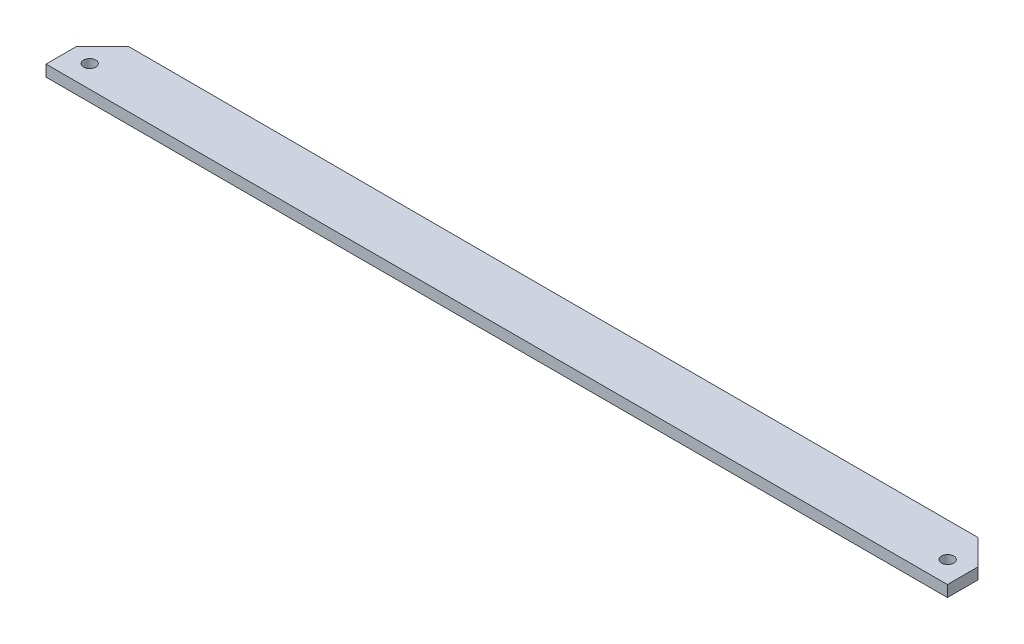
ISO-10303-21;
HEADER;
FILE_DESCRIPTION(('STEP AP214'),'2;1');
FILE_NAME('part.step','',(''),(''),'','','');
FILE_SCHEMA(('AUTOMOTIVE_DESIGN { 1 0 10303 214 1 1 1 1 }'));
ENDSEC;
DATA;
#1=APPLICATION_CONTEXT('core data for automotive mechanical design processes');
#2=APPLICATION_PROTOCOL_DEFINITION('international standard','automotive_design',2000,#1);
#3=PRODUCT_CONTEXT('',#1,'mechanical');
#4=PRODUCT('Part','Part','',(#3));
#5=PRODUCT_RELATED_PRODUCT_CATEGORY('part','',(#4));
#6=PRODUCT_DEFINITION_FORMATION('','',#4);
#7=PRODUCT_DEFINITION_CONTEXT('part definition',#1,'design');
#8=PRODUCT_DEFINITION('design','',#6,#7);
#9=PRODUCT_DEFINITION_SHAPE('','',#8);
#10=(LENGTH_UNIT() NAMED_UNIT(*) SI_UNIT(.MILLI.,.METRE.));
#11=(NAMED_UNIT(*) PLANE_ANGLE_UNIT() SI_UNIT($,.RADIAN.));
#12=(NAMED_UNIT(*) SI_UNIT($,.STERADIAN.) SOLID_ANGLE_UNIT());
#13=UNCERTAINTY_MEASURE_WITH_UNIT(LENGTH_MEASURE(1.E-05),#10,'distance_accuracy_value','');
#14=(GEOMETRIC_REPRESENTATION_CONTEXT(3) GLOBAL_UNCERTAINTY_ASSIGNED_CONTEXT((#13)) GLOBAL_UNIT_ASSIGNED_CONTEXT((#10,
#11,#12)) REPRESENTATION_CONTEXT('',''));
#15=CARTESIAN_POINT('',(0.,0.,0.));
#16=DIRECTION('',(0.,0.,1.));
#17=DIRECTION('',(1.,0.,0.));
#18=AXIS2_PLACEMENT_3D('',#15,#16,#17);
#19=CARTESIAN_POINT('',(0.,5.8674,0.));
#20=DIRECTION('',(0.,0.,-1.));
#21=DIRECTION('',(-1.,0.,0.));
#22=AXIS2_PLACEMENT_3D('',#19,#20,#21);
#23=PLANE('',#22);
#24=DIRECTION('',(1.,0.,0.));
#25=VECTOR('',#24,1.);
#26=CARTESIAN_POINT('',(0.,0.,0.));
#27=LINE('',#26,#25);
#28=CARTESIAN_POINT('',(-234.1327174495,0.,0.));
#29=VERTEX_POINT('',#28);
#30=CARTESIAN_POINT('',(233.866472168473,0.,0.));
#31=VERTEX_POINT('',#30);
#32=EDGE_CURVE('E82',#29,#31,#27,.T.);
#33=ORIENTED_EDGE('',*,*,#32,.T.);
#34=DIRECTION('',(0.,-1.,0.));
#35=VECTOR('',#34,1.);
#36=CARTESIAN_POINT('',(233.866472168473,5.8674,0.));
#37=LINE('',#36,#35);
#38=CARTESIAN_POINT('',(233.866472168473,5.8674,0.));
#39=VERTEX_POINT('',#38);
#40=EDGE_CURVE('E11',#39,#31,#37,.T.);
#41=ORIENTED_EDGE('',*,*,#40,.F.);
#42=DIRECTION('',(1.,0.,0.));
#43=VECTOR('',#42,1.);
#44=CARTESIAN_POINT('',(0.,5.8674,0.));
#45=LINE('',#44,#43);
#46=CARTESIAN_POINT('',(-234.1327174495,5.8674,0.));
#47=VERTEX_POINT('',#46);
#48=EDGE_CURVE('E88',#47,#39,#45,.T.);
#49=ORIENTED_EDGE('',*,*,#48,.F.);
#50=DIRECTION('',(0.,-1.,0.));
#51=VECTOR('',#50,1.);
#52=CARTESIAN_POINT('',(-234.1327174495,5.8674,0.));
#53=LINE('',#52,#51);
#54=EDGE_CURVE('E119',#47,#29,#53,.T.);
#55=ORIENTED_EDGE('',*,*,#54,.T.);
#56=EDGE_LOOP('',(#33,#41,#49,#55));
#57=FACE_BOUND('',#56,.T.);
#58=ADVANCED_FACE('F33',(#57),#23,.F.);
#59=CARTESIAN_POINT('',(233.866472168473,5.8674,0.));
#60=DIRECTION('',(-1.,0.,0.));
#61=DIRECTION('',(0.,0.,1.));
#62=AXIS2_PLACEMENT_3D('',#59,#60,#61);
#63=PLANE('',#62);
#64=DIRECTION('',(0.,0.,-1.));
#65=VECTOR('',#64,1.);
#66=CARTESIAN_POINT('',(233.866472168473,0.,0.));
#67=LINE('',#66,#65);
#68=CARTESIAN_POINT('',(233.866472168473,0.,-15.8701501139216));
#69=VERTEX_POINT('',#68);
#70=EDGE_CURVE('E124',#31,#69,#67,.T.);
#71=ORIENTED_EDGE('',*,*,#70,.T.);
#72=DIRECTION('',(0.,-1.,0.));
#73=VECTOR('',#72,1.);
#74=CARTESIAN_POINT('',(233.866472168473,5.8674,-15.8701501139216));
#75=LINE('',#74,#73);
#76=CARTESIAN_POINT('',(233.866472168473,5.8674,-15.8701501139216));
#77=VERTEX_POINT('',#76);
#78=EDGE_CURVE('E41',#77,#69,#75,.T.);
#79=ORIENTED_EDGE('',*,*,#78,.F.);
#80=DIRECTION('',(0.,0.,-1.));
#81=VECTOR('',#80,1.);
#82=CARTESIAN_POINT('',(233.866472168473,5.8674,0.));
#83=LINE('',#82,#81);
#84=EDGE_CURVE('E155',#39,#77,#83,.T.);
#85=ORIENTED_EDGE('',*,*,#84,.F.);
#86=ORIENTED_EDGE('',*,*,#40,.T.);
#87=EDGE_LOOP('',(#71,#79,#85,#86));
#88=FACE_BOUND('',#87,.T.);
#89=ADVANCED_FACE('F196',(#88),#63,.F.);
#90=CARTESIAN_POINT('',(233.866472168473,5.8674,-15.8701501139216));
#91=DIRECTION('',(-0.707106781186548,0.,0.707106781186548));
#92=DIRECTION('',(0.707106781186548,0.,0.707106781186548));
#93=AXIS2_PLACEMENT_3D('',#90,#91,#92);
#94=PLANE('',#93);
#95=DIRECTION('',(-0.707106781186548,0.,-0.707106781186547));
#96=VECTOR('',#95,1.);
#97=CARTESIAN_POINT('',(233.866472168473,0.,-15.8701501139216));
#98=LINE('',#97,#96);
#99=CARTESIAN_POINT('',(220.6625,0.,-29.074122282395));
#100=VERTEX_POINT('',#99);
#101=EDGE_CURVE('E127',#69,#100,#98,.T.);
#102=ORIENTED_EDGE('',*,*,#101,.T.);
#103=DIRECTION('',(0.,-1.,0.));
#104=VECTOR('',#103,1.);
#105=CARTESIAN_POINT('',(220.6625,5.8674,-29.074122282395));
#106=LINE('',#105,#104);
#107=CARTESIAN_POINT('',(220.6625,5.8674,-29.074122282395));
#108=VERTEX_POINT('',#107);
#109=EDGE_CURVE('E139',#108,#100,#106,.T.);
#110=ORIENTED_EDGE('',*,*,#109,.F.);
#111=DIRECTION('',(-0.707106781186548,0.,-0.707106781186547));
#112=VECTOR('',#111,1.);
#113=CARTESIAN_POINT('',(233.866472168473,5.8674,-15.8701501139216));
#114=LINE('',#113,#112);
#115=EDGE_CURVE('E148',#77,#108,#114,.T.);
#116=ORIENTED_EDGE('',*,*,#115,.F.);
#117=ORIENTED_EDGE('',*,*,#78,.T.);
#118=EDGE_LOOP('',(#102,#110,#116,#117));
#119=FACE_BOUND('',#118,.T.);
#120=ADVANCED_FACE('F146',(#119),#94,.F.);
#121=CARTESIAN_POINT('',(220.6625,5.8674,-29.074122282395));
#122=DIRECTION('',(0.,0.,1.));
#123=DIRECTION('',(1.,0.,0.));
#124=AXIS2_PLACEMENT_3D('',#121,#122,#123);
#125=PLANE('',#124);
#126=DIRECTION('',(-1.,0.,0.));
#127=VECTOR('',#126,1.);
#128=CARTESIAN_POINT('',(220.6625,0.,-29.074122282395));
#129=LINE('',#128,#127);
#130=CARTESIAN_POINT('',(0.,0.,-29.074122282395));
#131=VERTEX_POINT('',#130);
#132=EDGE_CURVE('E129',#100,#131,#129,.T.);
#133=ORIENTED_EDGE('',*,*,#132,.T.);
#134=DIRECTION('',(0.,-1.,0.));
#135=VECTOR('',#134,1.);
#136=CARTESIAN_POINT('',(0.,5.8674,-29.074122282395));
#137=LINE('',#136,#135);
#138=CARTESIAN_POINT('',(0.,5.8674,-29.074122282395));
#139=VERTEX_POINT('',#138);
#140=EDGE_CURVE('E114',#139,#131,#137,.T.);
#141=ORIENTED_EDGE('',*,*,#140,.F.);
#142=DIRECTION('',(-1.,0.,0.));
#143=VECTOR('',#142,1.);
#144=CARTESIAN_POINT('',(220.6625,5.8674,-29.074122282395));
#145=LINE('',#144,#143);
#146=EDGE_CURVE('E105',#108,#139,#145,.T.);
#147=ORIENTED_EDGE('',*,*,#146,.F.);
#148=ORIENTED_EDGE('',*,*,#109,.T.);
#149=EDGE_LOOP('',(#133,#141,#147,#148));
#150=FACE_BOUND('',#149,.T.);
#151=ADVANCED_FACE('F154',(#150),#125,.F.);
#152=CARTESIAN_POINT('',(-220.662333267896,5.8674,-29.3453841816037));
#153=DIRECTION('',(-0.0012293067431428,0.,0.99999924440218));
#154=DIRECTION('',(0.99999924440218,0.,0.0012293067431428));
#155=AXIS2_PLACEMENT_3D('',#152,#153,#154);
#156=PLANE('',#155);
#157=DIRECTION('',(-0.99999924440218,0.,-0.0012293067431428));
#158=VECTOR('',#157,1.);
#159=CARTESIAN_POINT('',(-220.662333267896,0.,-29.3453841816037));
#160=LINE('',#159,#158);
#161=CARTESIAN_POINT('',(-220.662333267896,0.,-29.3453841816037));
#162=VERTEX_POINT('',#161);
#163=EDGE_CURVE('E113',#131,#162,#160,.T.);
#164=ORIENTED_EDGE('',*,*,#163,.T.);
#165=DIRECTION('',(0.,-1.,0.));
#166=VECTOR('',#165,1.);
#167=CARTESIAN_POINT('',(-220.662333267896,5.8674,-29.3453841816037));
#168=LINE('',#167,#166);
#169=CARTESIAN_POINT('',(-220.662333267896,5.8674,-29.3453841816037));
#170=VERTEX_POINT('',#169);
#171=EDGE_CURVE('E110',#170,#162,#168,.T.);
#172=ORIENTED_EDGE('',*,*,#171,.F.);
#173=DIRECTION('',(-0.99999924440218,0.,-0.0012293067431428));
#174=VECTOR('',#173,1.);
#175=CARTESIAN_POINT('',(-220.662333267896,5.8674,-29.3453841816037));
#176=LINE('',#175,#174);
#177=EDGE_CURVE('E99',#139,#170,#176,.T.);
#178=ORIENTED_EDGE('',*,*,#177,.F.);
#179=ORIENTED_EDGE('',*,*,#140,.T.);
#180=EDGE_LOOP('',(#164,#172,#178,#179));
#181=FACE_BOUND('',#180,.T.);
#182=ADVANCED_FACE('F111',(#181),#156,.F.);
#183=CARTESIAN_POINT('',(-234.1327174495,5.8674,-15.875));
#184=DIRECTION('',(0.707106781186548,0.,0.707106781186548));
#185=DIRECTION('',(0.707106781186548,0.,-0.707106781186548));
#186=AXIS2_PLACEMENT_3D('',#183,#184,#185);
#187=PLANE('',#186);
#188=DIRECTION('',(-0.707106781186548,0.,0.707106781186548));
#189=VECTOR('',#188,1.);
#190=CARTESIAN_POINT('',(-234.1327174495,0.,-15.875));
#191=LINE('',#190,#189);
#192=CARTESIAN_POINT('',(-234.1327174495,0.,-15.875));
#193=VERTEX_POINT('',#192);
#194=EDGE_CURVE('E75',#162,#193,#191,.T.);
#195=ORIENTED_EDGE('',*,*,#194,.T.);
#196=DIRECTION('',(0.,-1.,0.));
#197=VECTOR('',#196,1.);
#198=CARTESIAN_POINT('',(-234.1327174495,5.8674,-15.875));
#199=LINE('',#198,#197);
#200=CARTESIAN_POINT('',(-234.1327174495,5.8674,-15.875));
#201=VERTEX_POINT('',#200);
#202=EDGE_CURVE('E115',#201,#193,#199,.T.);
#203=ORIENTED_EDGE('',*,*,#202,.F.);
#204=DIRECTION('',(-0.707106781186548,0.,0.707106781186548));
#205=VECTOR('',#204,1.);
#206=CARTESIAN_POINT('',(-234.1327174495,5.8674,-15.875));
#207=LINE('',#206,#205);
#208=EDGE_CURVE('E103',#170,#201,#207,.T.);
#209=ORIENTED_EDGE('',*,*,#208,.F.);
#210=ORIENTED_EDGE('',*,*,#171,.T.);
#211=EDGE_LOOP('',(#195,#203,#209,#210));
#212=FACE_BOUND('',#211,.T.);
#213=ADVANCED_FACE('F117',(#212),#187,.F.);
#214=CARTESIAN_POINT('',(-234.1327174495,5.8674,0.));
#215=DIRECTION('',(1.,0.,0.));
#216=DIRECTION('',(0.,0.,-1.));
#217=AXIS2_PLACEMENT_3D('',#214,#215,#216);
#218=PLANE('',#217);
#219=DIRECTION('',(0.,0.,1.));
#220=VECTOR('',#219,1.);
#221=CARTESIAN_POINT('',(-234.1327174495,0.,0.));
#222=LINE('',#221,#220);
#223=EDGE_CURVE('E133',#193,#29,#222,.T.);
#224=ORIENTED_EDGE('',*,*,#223,.T.);
#225=ORIENTED_EDGE('',*,*,#54,.F.);
#226=DIRECTION('',(0.,0.,1.));
#227=VECTOR('',#226,1.);
#228=CARTESIAN_POINT('',(-234.1327174495,5.8674,0.));
#229=LINE('',#228,#227);
#230=EDGE_CURVE('E49',#201,#47,#229,.T.);
#231=ORIENTED_EDGE('',*,*,#230,.F.);
#232=ORIENTED_EDGE('',*,*,#202,.T.);
#233=EDGE_LOOP('',(#224,#225,#231,#232));
#234=FACE_BOUND('',#233,.T.);
#235=ADVANCED_FACE('F187',(#234),#218,.F.);
#236=CARTESIAN_POINT('',(0.,5.8674,0.));
#237=DIRECTION('',(0.,-1.,0.));
#238=DIRECTION('',(0.,0.,-1.));
#239=AXIS2_PLACEMENT_3D('',#236,#237,#238);
#240=PLANE('',#239);
#241=CARTESIAN_POINT('',(222.690472168473,5.8674,-11.294122282395));
#242=DIRECTION('',(0.,-1.,0.));
#243=DIRECTION('',(0.,0.,-1.));
#244=AXIS2_PLACEMENT_3D('',#241,#242,#243);
#245=CIRCLE('',#244,3.175);
#246=CARTESIAN_POINT('',(222.690472168473,5.8674,-14.469122282395));
#247=VERTEX_POINT('',#246);
#248=EDGE_CURVE('E165',#247,#247,#245,.T.);
#249=ORIENTED_EDGE('',*,*,#248,.T.);
#250=EDGE_LOOP('',(#249));
#251=FACE_BOUND('',#250,.T.);
#252=CARTESIAN_POINT('',(-223.0202174495,5.8674,-11.5682693121785));
#253=DIRECTION('',(0.,-1.,0.));
#254=DIRECTION('',(0.,0.,-1.));
#255=AXIS2_PLACEMENT_3D('',#252,#253,#254);
#256=CIRCLE('',#255,3.175);
#257=CARTESIAN_POINT('',(-223.0202174495,5.8674,-14.7432693121785));
#258=VERTEX_POINT('',#257);
#259=EDGE_CURVE('E125',#258,#258,#256,.T.);
#260=ORIENTED_EDGE('',*,*,#259,.T.);
#261=EDGE_LOOP('',(#260));
#262=FACE_BOUND('',#261,.T.);
#263=ORIENTED_EDGE('',*,*,#48,.T.);
#264=ORIENTED_EDGE('',*,*,#84,.T.);
#265=ORIENTED_EDGE('',*,*,#115,.T.);
#266=ORIENTED_EDGE('',*,*,#146,.T.);
#267=ORIENTED_EDGE('',*,*,#177,.T.);
#268=ORIENTED_EDGE('',*,*,#208,.T.);
#269=ORIENTED_EDGE('',*,*,#230,.T.);
#270=EDGE_LOOP('',(#263,#264,#265,#266,#267,#268,#269));
#271=FACE_BOUND('',#270,.T.);
#272=ADVANCED_FACE('F101',(#251,#262,#271),#240,.F.);
#273=CARTESIAN_POINT('',(0.,0.,0.));
#274=DIRECTION('',(0.,-1.,0.));
#275=DIRECTION('',(0.,0.,-1.));
#276=AXIS2_PLACEMENT_3D('',#273,#274,#275);
#277=PLANE('',#276);
#278=CARTESIAN_POINT('',(222.690472168473,0.,-11.294122282395));
#279=DIRECTION('',(0.,-1.,0.));
#280=DIRECTION('',(0.,0.,-1.));
#281=AXIS2_PLACEMENT_3D('',#278,#279,#280);
#282=CIRCLE('',#281,3.175);
#283=CARTESIAN_POINT('',(222.690472168473,0.,-14.469122282395));
#284=VERTEX_POINT('',#283);
#285=EDGE_CURVE('E168',#284,#284,#282,.T.);
#286=ORIENTED_EDGE('',*,*,#285,.F.);
#287=EDGE_LOOP('',(#286));
#288=FACE_BOUND('',#287,.T.);
#289=CARTESIAN_POINT('',(-223.0202174495,0.,-11.5682693121785));
#290=DIRECTION('',(0.,-1.,0.));
#291=DIRECTION('',(0.,0.,-1.));
#292=AXIS2_PLACEMENT_3D('',#289,#290,#291);
#293=CIRCLE('',#292,3.175);
#294=CARTESIAN_POINT('',(-223.0202174495,0.,-14.7432693121785));
#295=VERTEX_POINT('',#294);
#296=EDGE_CURVE('E162',#295,#295,#293,.T.);
#297=ORIENTED_EDGE('',*,*,#296,.F.);
#298=EDGE_LOOP('',(#297));
#299=FACE_BOUND('',#298,.T.);
#300=ORIENTED_EDGE('',*,*,#32,.F.);
#301=ORIENTED_EDGE('',*,*,#223,.F.);
#302=ORIENTED_EDGE('',*,*,#194,.F.);
#303=ORIENTED_EDGE('',*,*,#163,.F.);
#304=ORIENTED_EDGE('',*,*,#132,.F.);
#305=ORIENTED_EDGE('',*,*,#101,.F.);
#306=ORIENTED_EDGE('',*,*,#70,.F.);
#307=EDGE_LOOP('',(#300,#301,#302,#303,#304,#305,#306));
#308=FACE_BOUND('',#307,.T.);
#309=ADVANCED_FACE('F152',(#288,#299,#308),#277,.T.);
#310=CARTESIAN_POINT('',(-223.0202174495,10.16,-11.5682693121785));
#311=DIRECTION('',(0.,-1.,0.));
#312=DIRECTION('',(0.,0.,-1.));
#313=AXIS2_PLACEMENT_3D('',#310,#311,#312);
#314=CYLINDRICAL_SURFACE('',#313,3.175);
#315=ORIENTED_EDGE('',*,*,#296,.T.);
#316=EDGE_LOOP('',(#315));
#317=FACE_BOUND('',#316,.T.);
#318=ORIENTED_EDGE('',*,*,#259,.F.);
#319=EDGE_LOOP('',(#318));
#320=FACE_BOUND('',#319,.T.);
#321=ADVANCED_FACE('F177',(#317,#320),#314,.F.);
#322=CARTESIAN_POINT('',(222.690472168473,10.16,-11.294122282395));
#323=DIRECTION('',(0.,-1.,0.));
#324=DIRECTION('',(0.,0.,-1.));
#325=AXIS2_PLACEMENT_3D('',#322,#323,#324);
#326=CYLINDRICAL_SURFACE('',#325,3.175);
#327=ORIENTED_EDGE('',*,*,#285,.T.);
#328=EDGE_LOOP('',(#327));
#329=FACE_BOUND('',#328,.T.);
#330=ORIENTED_EDGE('',*,*,#248,.F.);
#331=EDGE_LOOP('',(#330));
#332=FACE_BOUND('',#331,.T.);
#333=ADVANCED_FACE('F172',(#329,#332),#326,.F.);
#334=CLOSED_SHELL('',(#58,#89,#120,#151,#182,#213,#235,#272,#309,#321,#333));
#335=MANIFOLD_SOLID_BREP('B2',#334);
#336=ADVANCED_BREP_SHAPE_REPRESENTATION('',(#18,#335),#14);
#337=SHAPE_DEFINITION_REPRESENTATION(#9,#336);
ENDSEC;
END-ISO-10303-21;
